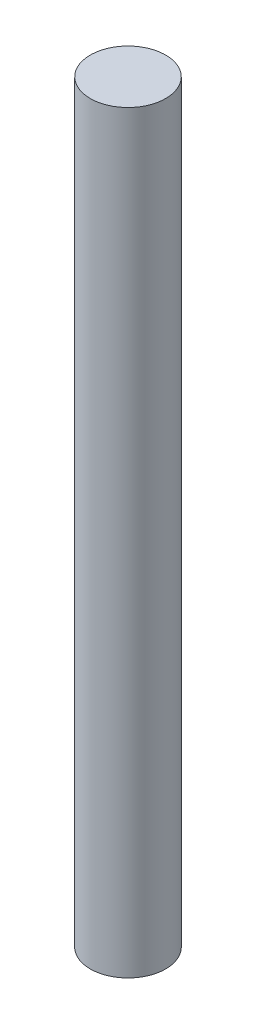
ISO-10303-21;
HEADER;
FILE_DESCRIPTION(('STEP AP214'),'2;1');
FILE_NAME('part.step','',(''),(''),'','','');
FILE_SCHEMA(('AUTOMOTIVE_DESIGN { 1 0 10303 214 1 1 1 1 }'));
ENDSEC;
DATA;
#1=APPLICATION_CONTEXT('core data for automotive mechanical design processes');
#2=APPLICATION_PROTOCOL_DEFINITION('international standard','automotive_design',2000,#1);
#3=PRODUCT_CONTEXT('',#1,'mechanical');
#4=PRODUCT('Part','Part','',(#3));
#5=PRODUCT_RELATED_PRODUCT_CATEGORY('part','',(#4));
#6=PRODUCT_DEFINITION_FORMATION('','',#4);
#7=PRODUCT_DEFINITION_CONTEXT('part definition',#1,'design');
#8=PRODUCT_DEFINITION('design','',#6,#7);
#9=PRODUCT_DEFINITION_SHAPE('','',#8);
#10=(LENGTH_UNIT() NAMED_UNIT(*) SI_UNIT(.MILLI.,.METRE.));
#11=(NAMED_UNIT(*) PLANE_ANGLE_UNIT() SI_UNIT($,.RADIAN.));
#12=(NAMED_UNIT(*) SI_UNIT($,.STERADIAN.) SOLID_ANGLE_UNIT());
#13=UNCERTAINTY_MEASURE_WITH_UNIT(LENGTH_MEASURE(1.E-05),#10,'distance_accuracy_value','');
#14=(GEOMETRIC_REPRESENTATION_CONTEXT(3) GLOBAL_UNCERTAINTY_ASSIGNED_CONTEXT((#13)) GLOBAL_UNIT_ASSIGNED_CONTEXT((#10,
#11,#12)) REPRESENTATION_CONTEXT('',''));
#15=CARTESIAN_POINT('',(0.,0.,0.));
#16=DIRECTION('',(0.,0.,1.));
#17=DIRECTION('',(1.,0.,0.));
#18=AXIS2_PLACEMENT_3D('',#15,#16,#17);
#19=CARTESIAN_POINT('',(0.,20.,0.));
#20=DIRECTION('',(0.,-1.,0.));
#21=DIRECTION('',(0.,0.,-1.));
#22=AXIS2_PLACEMENT_3D('',#19,#20,#21);
#23=CYLINDRICAL_SURFACE('',#22,1.);
#24=CARTESIAN_POINT('',(0.,20.,0.));
#25=DIRECTION('',(0.,1.,0.));
#26=DIRECTION('',(0.,0.,1.));
#27=AXIS2_PLACEMENT_3D('',#24,#25,#26);
#28=CIRCLE('',#27,1.);
#29=CARTESIAN_POINT('',(0.,20.,1.));
#30=VERTEX_POINT('',#29);
#31=EDGE_CURVE('E10',#30,#30,#28,.T.);
#32=ORIENTED_EDGE('',*,*,#31,.F.);
#33=EDGE_LOOP('',(#32));
#34=FACE_BOUND('',#33,.T.);
#35=CARTESIAN_POINT('',(0.,0.,0.));
#36=DIRECTION('',(0.,1.,0.));
#37=DIRECTION('',(0.,0.,1.));
#38=AXIS2_PLACEMENT_3D('',#35,#36,#37);
#39=CIRCLE('',#38,1.);
#40=CARTESIAN_POINT('',(0.,0.,1.));
#41=VERTEX_POINT('',#40);
#42=EDGE_CURVE('E40',#41,#41,#39,.T.);
#43=ORIENTED_EDGE('',*,*,#42,.T.);
#44=EDGE_LOOP('',(#43));
#45=FACE_BOUND('',#44,.T.);
#46=ADVANCED_FACE('F37',(#34,#45),#23,.T.);
#47=CARTESIAN_POINT('',(0.,20.,0.));
#48=DIRECTION('',(0.,1.,0.));
#49=DIRECTION('',(0.,0.,1.));
#50=AXIS2_PLACEMENT_3D('',#47,#48,#49);
#51=PLANE('',#50);
#52=ORIENTED_EDGE('',*,*,#31,.T.);
#53=EDGE_LOOP('',(#52));
#54=FACE_BOUND('',#53,.T.);
#55=ADVANCED_FACE('F54',(#54),#51,.T.);
#56=CARTESIAN_POINT('',(0.,0.,0.));
#57=DIRECTION('',(0.,1.,0.));
#58=DIRECTION('',(0.,0.,1.));
#59=AXIS2_PLACEMENT_3D('',#56,#57,#58);
#60=PLANE('',#59);
#61=ORIENTED_EDGE('',*,*,#42,.F.);
#62=EDGE_LOOP('',(#61));
#63=FACE_BOUND('',#62,.T.);
#64=ADVANCED_FACE('F52',(#63),#60,.F.);
#65=CLOSED_SHELL('',(#46,#55,#64));
#66=MANIFOLD_SOLID_BREP('B2',#65);
#67=ADVANCED_BREP_SHAPE_REPRESENTATION('',(#18,#66),#14);
#68=SHAPE_DEFINITION_REPRESENTATION(#9,#67);
ENDSEC;
END-ISO-10303-21;
